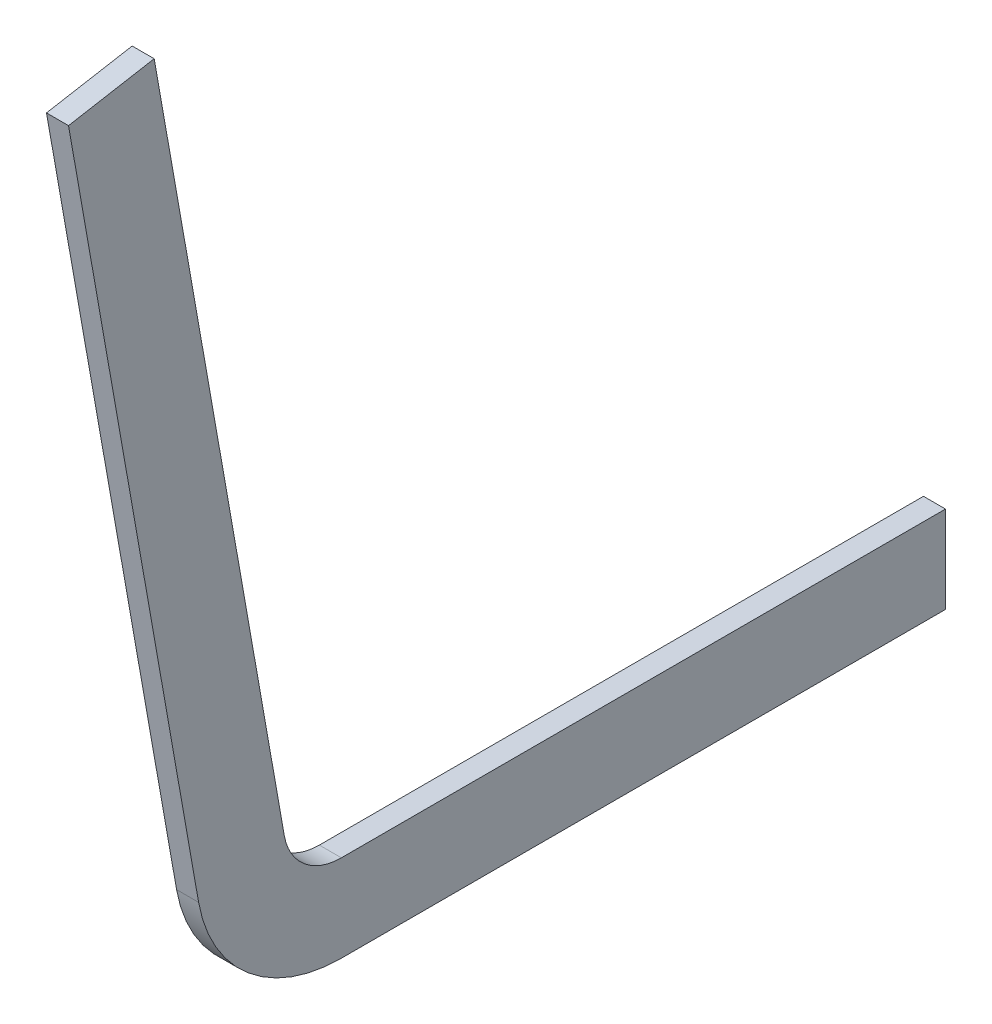
ISO-10303-21;
HEADER;
FILE_DESCRIPTION(('STEP AP214'),'2;1');
FILE_NAME('part.step','',(''),(''),'','','');
FILE_SCHEMA(('AUTOMOTIVE_DESIGN { 1 0 10303 214 1 1 1 1 }'));
ENDSEC;
DATA;
#1=APPLICATION_CONTEXT('core data for automotive mechanical design processes');
#2=APPLICATION_PROTOCOL_DEFINITION('international standard','automotive_design',2000,#1);
#3=PRODUCT_CONTEXT('',#1,'mechanical');
#4=PRODUCT('Part','Part','',(#3));
#5=PRODUCT_RELATED_PRODUCT_CATEGORY('part','',(#4));
#6=PRODUCT_DEFINITION_FORMATION('','',#4);
#7=PRODUCT_DEFINITION_CONTEXT('part definition',#1,'design');
#8=PRODUCT_DEFINITION('design','',#6,#7);
#9=PRODUCT_DEFINITION_SHAPE('','',#8);
#10=(LENGTH_UNIT() NAMED_UNIT(*) SI_UNIT(.MILLI.,.METRE.));
#11=(NAMED_UNIT(*) PLANE_ANGLE_UNIT() SI_UNIT($,.RADIAN.));
#12=(NAMED_UNIT(*) SI_UNIT($,.STERADIAN.) SOLID_ANGLE_UNIT());
#13=UNCERTAINTY_MEASURE_WITH_UNIT(LENGTH_MEASURE(1.E-05),#10,'distance_accuracy_value','');
#14=(GEOMETRIC_REPRESENTATION_CONTEXT(3) GLOBAL_UNCERTAINTY_ASSIGNED_CONTEXT((#13)) GLOBAL_UNIT_ASSIGNED_CONTEXT((#10,
#11,#12)) REPRESENTATION_CONTEXT('',''));
#15=CARTESIAN_POINT('',(0.,0.,0.));
#16=DIRECTION('',(0.,0.,1.));
#17=DIRECTION('',(1.,0.,0.));
#18=AXIS2_PLACEMENT_3D('',#15,#16,#17);
#19=CARTESIAN_POINT('',(1.9,-157.4,84.1954981558865));
#20=DIRECTION('',(-1.,0.,0.));
#21=DIRECTION('',(0.,0.,1.));
#22=AXIS2_PLACEMENT_3D('',#19,#20,#21);
#23=CYLINDRICAL_SURFACE('',#22,25.);
#24=CARTESIAN_POINT('',(-1.9,-157.4,84.1954981558865));
#25=DIRECTION('',(1.,0.,0.));
#26=DIRECTION('',(0.,0.,-1.));
#27=AXIS2_PLACEMENT_3D('',#24,#25,#26);
#28=CIRCLE('',#27,25.);
#29=CARTESIAN_POINT('',(-1.9,-161.741204441673,108.815691981192));
#30=VERTEX_POINT('',#29);
#31=CARTESIAN_POINT('',(-1.9,-182.4,84.1954981558865));
#32=VERTEX_POINT('',#31);
#33=EDGE_CURVE('E129',#30,#32,#28,.T.);
#34=ORIENTED_EDGE('',*,*,#33,.T.);
#35=DIRECTION('',(-1.,0.,0.));
#36=VECTOR('',#35,1.);
#37=CARTESIAN_POINT('',(1.9,-182.4,84.1954981558865));
#38=LINE('',#37,#36);
#39=CARTESIAN_POINT('',(1.9,-182.4,84.1954981558865));
#40=VERTEX_POINT('',#39);
#41=EDGE_CURVE('E11',#40,#32,#38,.T.);
#42=ORIENTED_EDGE('',*,*,#41,.F.);
#43=CARTESIAN_POINT('',(1.9,-157.4,84.1954981558865));
#44=DIRECTION('',(1.,0.,0.));
#45=DIRECTION('',(0.,0.,-1.));
#46=AXIS2_PLACEMENT_3D('',#43,#44,#45);
#47=CIRCLE('',#46,25.);
#48=CARTESIAN_POINT('',(1.9,-161.741204441673,108.815691981192));
#49=VERTEX_POINT('',#48);
#50=EDGE_CURVE('E144',#49,#40,#47,.T.);
#51=ORIENTED_EDGE('',*,*,#50,.F.);
#52=DIRECTION('',(-1.,0.,0.));
#53=VECTOR('',#52,1.);
#54=CARTESIAN_POINT('',(1.9,-161.741204441673,108.815691981192));
#55=LINE('',#54,#53);
#56=EDGE_CURVE('E125',#49,#30,#55,.T.);
#57=ORIENTED_EDGE('',*,*,#56,.T.);
#58=EDGE_LOOP('',(#34,#42,#51,#57));
#59=FACE_BOUND('',#58,.T.);
#60=ADVANCED_FACE('F33',(#59),#23,.T.);
#61=CARTESIAN_POINT('',(1.9,-182.4,80.));
#62=DIRECTION('',(0.,1.,0.));
#63=DIRECTION('',(0.,0.,1.));
#64=AXIS2_PLACEMENT_3D('',#61,#62,#63);
#65=PLANE('',#64);
#66=DIRECTION('',(0.,0.,-1.));
#67=VECTOR('',#66,1.);
#68=CARTESIAN_POINT('',(-1.9,-182.4,80.));
#69=LINE('',#68,#67);
#70=CARTESIAN_POINT('',(-1.9,-182.4,-20.));
#71=VERTEX_POINT('',#70);
#72=EDGE_CURVE('E132',#32,#71,#69,.T.);
#73=ORIENTED_EDGE('',*,*,#72,.T.);
#74=DIRECTION('',(-1.,0.,0.));
#75=VECTOR('',#74,1.);
#76=CARTESIAN_POINT('',(1.9,-182.4,-20.));
#77=LINE('',#76,#75);
#78=CARTESIAN_POINT('',(1.9,-182.4,-20.));
#79=VERTEX_POINT('',#78);
#80=EDGE_CURVE('E41',#79,#71,#77,.T.);
#81=ORIENTED_EDGE('',*,*,#80,.F.);
#82=DIRECTION('',(0.,0.,-1.));
#83=VECTOR('',#82,1.);
#84=CARTESIAN_POINT('',(1.9,-182.4,84.1954981558865));
#85=LINE('',#84,#83);
#86=EDGE_CURVE('E92',#40,#79,#85,.T.);
#87=ORIENTED_EDGE('',*,*,#86,.F.);
#88=ORIENTED_EDGE('',*,*,#41,.T.);
#89=EDGE_LOOP('',(#73,#81,#87,#88));
#90=FACE_BOUND('',#89,.T.);
#91=ADVANCED_FACE('F178',(#90),#65,.F.);
#92=CARTESIAN_POINT('',(1.9,-182.4,-20.));
#93=DIRECTION('',(0.,0.,1.));
#94=DIRECTION('',(1.,0.,0.));
#95=AXIS2_PLACEMENT_3D('',#92,#93,#94);
#96=PLANE('',#95);
#97=DIRECTION('',(0.,1.,0.));
#98=VECTOR('',#97,1.);
#99=CARTESIAN_POINT('',(-1.9,-182.4,-20.));
#100=LINE('',#99,#98);
#101=CARTESIAN_POINT('',(-1.9,-167.4,-20.));
#102=VERTEX_POINT('',#101);
#103=EDGE_CURVE('E134',#71,#102,#100,.T.);
#104=ORIENTED_EDGE('',*,*,#103,.T.);
#105=DIRECTION('',(-1.,0.,0.));
#106=VECTOR('',#105,1.);
#107=CARTESIAN_POINT('',(1.9,-167.4,-20.));
#108=LINE('',#107,#106);
#109=CARTESIAN_POINT('',(1.9,-167.4,-20.));
#110=VERTEX_POINT('',#109);
#111=EDGE_CURVE('E151',#110,#102,#108,.T.);
#112=ORIENTED_EDGE('',*,*,#111,.F.);
#113=DIRECTION('',(0.,1.,0.));
#114=VECTOR('',#113,1.);
#115=CARTESIAN_POINT('',(1.9,-182.4,-20.));
#116=LINE('',#115,#114);
#117=EDGE_CURVE('E159',#79,#110,#116,.T.);
#118=ORIENTED_EDGE('',*,*,#117,.F.);
#119=ORIENTED_EDGE('',*,*,#80,.T.);
#120=EDGE_LOOP('',(#104,#112,#118,#119));
#121=FACE_BOUND('',#120,.T.);
#122=ADVANCED_FACE('F157',(#121),#96,.F.);
#123=CARTESIAN_POINT('',(1.9,-167.4,80.));
#124=DIRECTION('',(0.,-1.,0.));
#125=DIRECTION('',(0.,0.,-1.));
#126=AXIS2_PLACEMENT_3D('',#123,#124,#125);
#127=PLANE('',#126);
#128=DIRECTION('',(0.,0.,1.));
#129=VECTOR('',#128,1.);
#130=CARTESIAN_POINT('',(-1.9,-167.4,80.));
#131=LINE('',#130,#129);
#132=CARTESIAN_POINT('',(-1.9,-167.4,84.1954981558865));
#133=VERTEX_POINT('',#132);
#134=EDGE_CURVE('E137',#102,#133,#131,.T.);
#135=ORIENTED_EDGE('',*,*,#134,.T.);
#136=DIRECTION('',(-1.,0.,0.));
#137=VECTOR('',#136,1.);
#138=CARTESIAN_POINT('',(1.9,-167.4,84.1954981558865));
#139=LINE('',#138,#137);
#140=CARTESIAN_POINT('',(1.9,-167.4,84.1954981558865));
#141=VERTEX_POINT('',#140);
#142=EDGE_CURVE('E148',#141,#133,#139,.T.);
#143=ORIENTED_EDGE('',*,*,#142,.F.);
#144=DIRECTION('',(0.,0.,1.));
#145=VECTOR('',#144,1.);
#146=CARTESIAN_POINT('',(1.9,-167.4,-20.));
#147=LINE('',#146,#145);
#148=EDGE_CURVE('E170',#110,#141,#147,.T.);
#149=ORIENTED_EDGE('',*,*,#148,.F.);
#150=ORIENTED_EDGE('',*,*,#111,.T.);
#151=EDGE_LOOP('',(#135,#143,#149,#150));
#152=FACE_BOUND('',#151,.T.);
#153=ADVANCED_FACE('F166',(#152),#127,.F.);
#154=CARTESIAN_POINT('',(1.9,-157.4,84.1954981558865));
#155=DIRECTION('',(-1.,0.,0.));
#156=DIRECTION('',(0.,0.,1.));
#157=AXIS2_PLACEMENT_3D('',#154,#155,#156);
#158=CYLINDRICAL_SURFACE('',#157,10.);
#159=CARTESIAN_POINT('',(-1.9,-157.4,84.1954981558865));
#160=DIRECTION('',(-1.,0.,0.));
#161=DIRECTION('',(0.,0.,-1.));
#162=AXIS2_PLACEMENT_3D('',#159,#160,#161);
#163=CIRCLE('',#162,10.);
#164=CARTESIAN_POINT('',(-1.9,-159.136481776669,94.0435756860086));
#165=VERTEX_POINT('',#164);
#166=EDGE_CURVE('E139',#133,#165,#163,.T.);
#167=ORIENTED_EDGE('',*,*,#166,.T.);
#168=DIRECTION('',(-1.,0.,0.));
#169=VECTOR('',#168,1.);
#170=CARTESIAN_POINT('',(1.9,-159.136481776669,94.0435756860086));
#171=LINE('',#170,#169);
#172=CARTESIAN_POINT('',(1.9,-159.136481776669,94.0435756860086));
#173=VERTEX_POINT('',#172);
#174=EDGE_CURVE('E120',#173,#165,#171,.T.);
#175=ORIENTED_EDGE('',*,*,#174,.F.);
#176=CARTESIAN_POINT('',(1.9,-157.4,84.1954981558865));
#177=DIRECTION('',(-1.,0.,0.));
#178=DIRECTION('',(0.,0.,-1.));
#179=AXIS2_PLACEMENT_3D('',#176,#177,#178);
#180=CIRCLE('',#179,10.);
#181=EDGE_CURVE('E111',#141,#173,#180,.T.);
#182=ORIENTED_EDGE('',*,*,#181,.F.);
#183=ORIENTED_EDGE('',*,*,#142,.T.);
#184=EDGE_LOOP('',(#167,#175,#182,#183));
#185=FACE_BOUND('',#184,.T.);
#186=ADVANCED_FACE('F169',(#185),#158,.F.);
#187=CARTESIAN_POINT('',(1.9,-159.136481776669,94.0435756860086));
#188=DIRECTION('',(0.,-0.173648177666928,0.984807753012208));
#189=DIRECTION('',(0.,-0.984807753012209,-0.173648177666928));
#190=AXIS2_PLACEMENT_3D('',#187,#188,#189);
#191=PLANE('',#190);
#192=DIRECTION('',(0.,0.984807753012209,0.173648177666928));
#193=VECTOR('',#192,1.);
#194=CARTESIAN_POINT('',(-1.9,-159.136481776669,94.0435756860086));
#195=LINE('',#194,#193);
#196=CARTESIAN_POINT('',(-1.9,-31.903753538478,116.478138503549));
#197=VERTEX_POINT('',#196);
#198=EDGE_CURVE('E119',#165,#197,#195,.T.);
#199=ORIENTED_EDGE('',*,*,#198,.T.);
#200=DIRECTION('',(-1.,0.,0.));
#201=VECTOR('',#200,1.);
#202=CARTESIAN_POINT('',(1.9,-31.903753538478,116.478138503549));
#203=LINE('',#202,#201);
#204=CARTESIAN_POINT('',(1.9,-31.903753538478,116.478138503549));
#205=VERTEX_POINT('',#204);
#206=EDGE_CURVE('E116',#205,#197,#203,.T.);
#207=ORIENTED_EDGE('',*,*,#206,.F.);
#208=DIRECTION('',(0.,0.984807753012209,0.173648177666928));
#209=VECTOR('',#208,1.);
#210=CARTESIAN_POINT('',(1.9,-159.136481776669,94.0435756860086));
#211=LINE('',#210,#209);
#212=EDGE_CURVE('E105',#173,#205,#211,.T.);
#213=ORIENTED_EDGE('',*,*,#212,.F.);
#214=ORIENTED_EDGE('',*,*,#174,.T.);
#215=EDGE_LOOP('',(#199,#207,#213,#214));
#216=FACE_BOUND('',#215,.T.);
#217=ADVANCED_FACE('F117',(#216),#191,.F.);
#218=CARTESIAN_POINT('',(1.9,-31.903753538478,116.478138503549));
#219=DIRECTION('',(0.,-0.984807753012209,-0.173648177666927));
#220=DIRECTION('',(0.,0.173648177666927,-0.984807753012209));
#221=AXIS2_PLACEMENT_3D('',#218,#219,#220);
#222=PLANE('',#221);
#223=DIRECTION('',(0.,-0.173648177666927,0.984807753012209));
#224=VECTOR('',#223,1.);
#225=CARTESIAN_POINT('',(-1.9,-31.903753538478,116.478138503549));
#226=LINE('',#225,#224);
#227=CARTESIAN_POINT('',(-1.9,-34.5084762034818,131.250254798732));
#228=VERTEX_POINT('',#227);
#229=EDGE_CURVE('E78',#197,#228,#226,.T.);
#230=ORIENTED_EDGE('',*,*,#229,.T.);
#231=DIRECTION('',(-1.,0.,0.));
#232=VECTOR('',#231,1.);
#233=CARTESIAN_POINT('',(1.9,-34.5084762034818,131.250254798732));
#234=LINE('',#233,#232);
#235=CARTESIAN_POINT('',(1.9,-34.5084762034818,131.250254798732));
#236=VERTEX_POINT('',#235);
#237=EDGE_CURVE('E121',#236,#228,#234,.T.);
#238=ORIENTED_EDGE('',*,*,#237,.F.);
#239=DIRECTION('',(0.,-0.173648177666927,0.984807753012209));
#240=VECTOR('',#239,1.);
#241=CARTESIAN_POINT('',(1.9,-31.903753538478,116.478138503549));
#242=LINE('',#241,#240);
#243=EDGE_CURVE('E109',#205,#236,#242,.T.);
#244=ORIENTED_EDGE('',*,*,#243,.F.);
#245=ORIENTED_EDGE('',*,*,#206,.T.);
#246=EDGE_LOOP('',(#230,#238,#244,#245));
#247=FACE_BOUND('',#246,.T.);
#248=ADVANCED_FACE('F123',(#247),#222,.F.);
#249=CARTESIAN_POINT('',(1.9,-34.5084762034818,131.250254798732));
#250=DIRECTION('',(0.,0.173648177666927,-0.984807753012209));
#251=DIRECTION('',(0.,0.984807753012209,0.173648177666927));
#252=AXIS2_PLACEMENT_3D('',#249,#250,#251);
#253=PLANE('',#252);
#254=DIRECTION('',(0.,-0.984807753012209,-0.173648177666927));
#255=VECTOR('',#254,1.);
#256=CARTESIAN_POINT('',(-1.9,-34.5084762034818,131.250254798732));
#257=LINE('',#256,#255);
#258=EDGE_CURVE('E84',#228,#30,#257,.T.);
#259=ORIENTED_EDGE('',*,*,#258,.T.);
#260=ORIENTED_EDGE('',*,*,#56,.F.);
#261=DIRECTION('',(0.,-0.984807753012209,-0.173648177666927));
#262=VECTOR('',#261,1.);
#263=CARTESIAN_POINT('',(1.9,-34.5084762034818,131.250254798732));
#264=LINE('',#263,#262);
#265=EDGE_CURVE('E49',#236,#49,#264,.T.);
#266=ORIENTED_EDGE('',*,*,#265,.F.);
#267=ORIENTED_EDGE('',*,*,#237,.T.);
#268=EDGE_LOOP('',(#259,#260,#266,#267));
#269=FACE_BOUND('',#268,.T.);
#270=ADVANCED_FACE('F194',(#269),#253,.F.);
#271=CARTESIAN_POINT('',(1.9,-157.4,84.1954981558865));
#272=DIRECTION('',(1.,0.,0.));
#273=DIRECTION('',(0.,0.,-1.));
#274=AXIS2_PLACEMENT_3D('',#271,#272,#273);
#275=PLANE('',#274);
#276=ORIENTED_EDGE('',*,*,#50,.T.);
#277=ORIENTED_EDGE('',*,*,#86,.T.);
#278=ORIENTED_EDGE('',*,*,#117,.T.);
#279=ORIENTED_EDGE('',*,*,#148,.T.);
#280=ORIENTED_EDGE('',*,*,#181,.T.);
#281=ORIENTED_EDGE('',*,*,#212,.T.);
#282=ORIENTED_EDGE('',*,*,#243,.T.);
#283=ORIENTED_EDGE('',*,*,#265,.T.);
#284=EDGE_LOOP('',(#276,#277,#278,#279,#280,#281,#282,#283));
#285=FACE_BOUND('',#284,.T.);
#286=ADVANCED_FACE('F107',(#285),#275,.T.);
#287=CARTESIAN_POINT('',(-1.9,-157.4,84.1954981558865));
#288=DIRECTION('',(1.,0.,0.));
#289=DIRECTION('',(0.,0.,-1.));
#290=AXIS2_PLACEMENT_3D('',#287,#288,#289);
#291=PLANE('',#290);
#292=ORIENTED_EDGE('',*,*,#33,.F.);
#293=ORIENTED_EDGE('',*,*,#258,.F.);
#294=ORIENTED_EDGE('',*,*,#229,.F.);
#295=ORIENTED_EDGE('',*,*,#198,.F.);
#296=ORIENTED_EDGE('',*,*,#166,.F.);
#297=ORIENTED_EDGE('',*,*,#134,.F.);
#298=ORIENTED_EDGE('',*,*,#103,.F.);
#299=ORIENTED_EDGE('',*,*,#72,.F.);
#300=EDGE_LOOP('',(#292,#293,#294,#295,#296,#297,#298,#299));
#301=FACE_BOUND('',#300,.T.);
#302=ADVANCED_FACE('F162',(#301),#291,.F.);
#303=CLOSED_SHELL('',(#60,#91,#122,#153,#186,#217,#248,#270,#286,#302));
#304=MANIFOLD_SOLID_BREP('B2',#303);
#305=ADVANCED_BREP_SHAPE_REPRESENTATION('',(#18,#304),#14);
#306=SHAPE_DEFINITION_REPRESENTATION(#9,#305);
ENDSEC;
END-ISO-10303-21;
